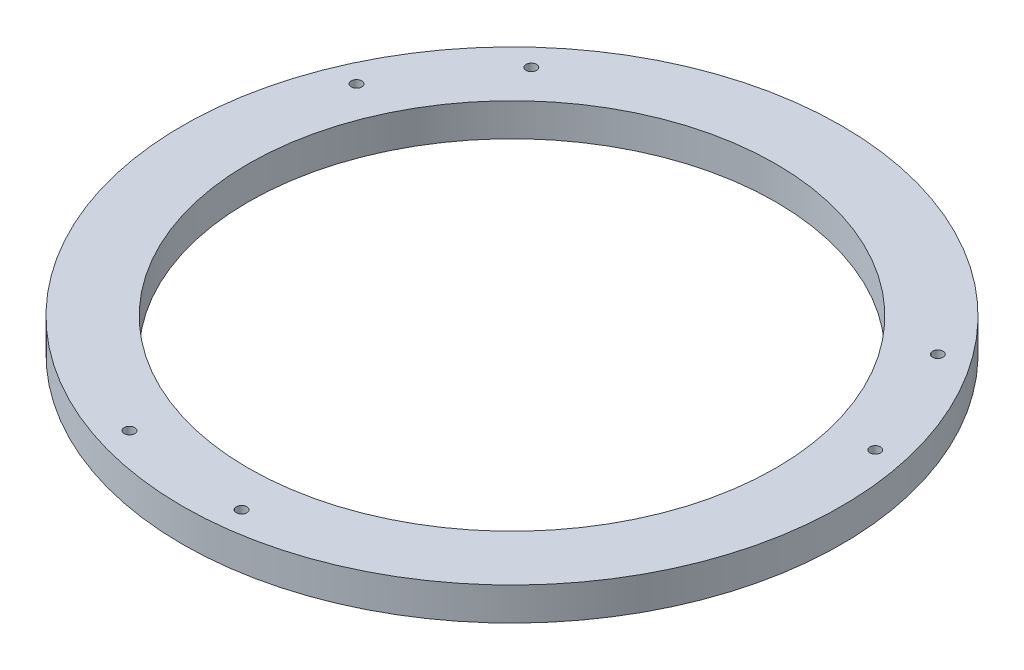
ISO-10303-21;
HEADER;
FILE_DESCRIPTION(('STEP AP214'),'2;1');
FILE_NAME('part.step','',(''),(''),'','','');
FILE_SCHEMA(('AUTOMOTIVE_DESIGN { 1 0 10303 214 1 1 1 1 }'));
ENDSEC;
DATA;
#1=APPLICATION_CONTEXT('core data for automotive mechanical design processes');
#2=APPLICATION_PROTOCOL_DEFINITION('international standard','automotive_design',2000,#1);
#3=PRODUCT_CONTEXT('',#1,'mechanical');
#4=PRODUCT('Part','Part','',(#3));
#5=PRODUCT_RELATED_PRODUCT_CATEGORY('part','',(#4));
#6=PRODUCT_DEFINITION_FORMATION('','',#4);
#7=PRODUCT_DEFINITION_CONTEXT('part definition',#1,'design');
#8=PRODUCT_DEFINITION('design','',#6,#7);
#9=PRODUCT_DEFINITION_SHAPE('','',#8);
#10=(LENGTH_UNIT() NAMED_UNIT(*) SI_UNIT(.MILLI.,.METRE.));
#11=(NAMED_UNIT(*) PLANE_ANGLE_UNIT() SI_UNIT($,.RADIAN.));
#12=(NAMED_UNIT(*) SI_UNIT($,.STERADIAN.) SOLID_ANGLE_UNIT());
#13=UNCERTAINTY_MEASURE_WITH_UNIT(LENGTH_MEASURE(1.E-05),#10,'distance_accuracy_value','');
#14=(GEOMETRIC_REPRESENTATION_CONTEXT(3) GLOBAL_UNCERTAINTY_ASSIGNED_CONTEXT((#13)) GLOBAL_UNIT_ASSIGNED_CONTEXT((#10,
#11,#12)) REPRESENTATION_CONTEXT('',''));
#15=CARTESIAN_POINT('',(0.,0.,0.));
#16=DIRECTION('',(0.,0.,1.));
#17=DIRECTION('',(1.,0.,0.));
#18=AXIS2_PLACEMENT_3D('',#15,#16,#17);
#19=CARTESIAN_POINT('',(0.,10.,0.));
#20=DIRECTION('',(0.,1.,0.));
#21=DIRECTION('',(0.,0.,1.));
#22=AXIS2_PLACEMENT_3D('',#19,#20,#21);
#23=PLANE('',#22);
#24=CARTESIAN_POINT('',(-27.9121513229262,10.,88.1598650664015));
#25=DIRECTION('',(0.,1.,0.));
#26=DIRECTION('',(0.866025403784436,0.,-0.500000000000004));
#27=AXIS2_PLACEMENT_3D('',#24,#25,#26);
#28=CIRCLE('',#27,1.60000000000001);
#29=CARTESIAN_POINT('',(-26.5265106768711,10.,87.3598650664015));
#30=VERTEX_POINT('',#29);
#31=EDGE_CURVE('E332',#30,#30,#28,.T.);
#32=ORIENTED_EDGE('',*,*,#31,.F.);
#33=EDGE_LOOP('',(#32));
#34=FACE_BOUND('',#33,.T.);
#35=CARTESIAN_POINT('',(9.89920365073338,10.,91.9415888870828));
#36=DIRECTION('',(0.,1.,0.));
#37=DIRECTION('',(0.866025403784436,0.,-0.500000000000004));
#38=AXIS2_PLACEMENT_3D('',#35,#36,#37);
#39=CIRCLE('',#38,1.59999999999999);
#40=CARTESIAN_POINT('',(11.2848442967885,10.,91.1415888870828));
#41=VERTEX_POINT('',#40);
#42=EDGE_CURVE('E336',#41,#41,#39,.T.);
#43=ORIENTED_EDGE('',*,*,#42,.F.);
#44=EDGE_LOOP('',(#43));
#45=FACE_BOUND('',#44,.T.);
#46=CARTESIAN_POINT('',(90.304758403175,10.,-19.9073004132716));
#47=DIRECTION('',(0.,1.,0.));
#48=DIRECTION('',(-0.866025403784443,0.,-0.499999999999992));
#49=AXIS2_PLACEMENT_3D('',#46,#47,#48);
#50=CIRCLE('',#49,1.60000000000001);
#51=CARTESIAN_POINT('',(88.9191177571199,10.,-20.7073004132716));
#52=VERTEX_POINT('',#51);
#53=EDGE_CURVE('E339',#52,#52,#50,.T.);
#54=ORIENTED_EDGE('',*,*,#53,.F.);
#55=EDGE_LOOP('',(#54));
#56=FACE_BOUND('',#55,.T.);
#57=CARTESIAN_POINT('',(74.6741498151518,10.,-54.5437562823125));
#58=DIRECTION('',(0.,1.,0.));
#59=DIRECTION('',(-0.866025403784443,0.,-0.499999999999992));
#60=AXIS2_PLACEMENT_3D('',#57,#58,#59);
#61=CIRCLE('',#60,1.59999999999999);
#62=CARTESIAN_POINT('',(73.2885091690967,10.,-55.3437562823125));
#63=VERTEX_POINT('',#62);
#64=EDGE_CURVE('E342',#63,#63,#61,.T.);
#65=ORIENTED_EDGE('',*,*,#64,.F.);
#66=EDGE_LOOP('',(#65));
#67=FACE_BOUND('',#66,.T.);
#68=CARTESIAN_POINT('',(-62.3926070802485,10.,-68.2525646531305));
#69=DIRECTION('',(0.,1.,0.));
#70=DIRECTION('',(0.,0.,1.));
#71=AXIS2_PLACEMENT_3D('',#68,#69,#70);
#72=CIRCLE('',#71,1.60000000000001);
#73=CARTESIAN_POINT('',(-62.3926070802485,10.,-66.6525646531306));
#74=VERTEX_POINT('',#73);
#75=EDGE_CURVE('E409',#74,#74,#72,.T.);
#76=ORIENTED_EDGE('',*,*,#75,.F.);
#77=EDGE_LOOP('',(#76));
#78=FACE_BOUND('',#77,.T.);
#79=CARTESIAN_POINT('',(-84.5733534658852,10.,-37.397832604771));
#80=DIRECTION('',(0.,1.,0.));
#81=DIRECTION('',(0.,0.,1.));
#82=AXIS2_PLACEMENT_3D('',#79,#80,#81);
#83=CIRCLE('',#82,1.59999999999999);
#84=CARTESIAN_POINT('',(-84.5733534658852,10.,-35.797832604771));
#85=VERTEX_POINT('',#84);
#86=EDGE_CURVE('E413',#85,#85,#83,.T.);
#87=ORIENTED_EDGE('',*,*,#86,.F.);
#88=EDGE_LOOP('',(#87));
#89=FACE_BOUND('',#88,.T.);
#90=CARTESIAN_POINT('',(0.,10.,0.));
#91=DIRECTION('',(0.,1.,0.));
#92=DIRECTION('',(0.,0.,1.));
#93=AXIS2_PLACEMENT_3D('',#90,#91,#92);
#94=CIRCLE('',#93,100.);
#95=CARTESIAN_POINT('',(0.,10.,100.));
#96=VERTEX_POINT('',#95);
#97=EDGE_CURVE('E11',#96,#96,#94,.T.);
#98=ORIENTED_EDGE('',*,*,#97,.T.);
#99=EDGE_LOOP('',(#98));
#100=FACE_BOUND('',#99,.T.);
#101=CARTESIAN_POINT('',(0.,10.,0.));
#102=DIRECTION('',(0.,1.,0.));
#103=DIRECTION('',(0.,0.,1.));
#104=AXIS2_PLACEMENT_3D('',#101,#102,#103);
#105=CIRCLE('',#104,80.);
#106=CARTESIAN_POINT('',(0.,10.,80.));
#107=VERTEX_POINT('',#106);
#108=EDGE_CURVE('E417',#107,#107,#105,.T.);
#109=ORIENTED_EDGE('',*,*,#108,.F.);
#110=EDGE_LOOP('',(#109));
#111=FACE_BOUND('',#110,.T.);
#112=ADVANCED_FACE('F33',(#34,#45,#56,#67,#78,#89,#100,#111),#23,.T.);
#113=CARTESIAN_POINT('',(0.,0.,0.));
#114=DIRECTION('',(0.,1.,0.));
#115=DIRECTION('',(0.,0.,1.));
#116=AXIS2_PLACEMENT_3D('',#113,#114,#115);
#117=PLANE('',#116);
#118=DIRECTION('',(-0.193244388605381,0.,-0.981150654218063));
#119=VECTOR('',#118,1.);
#120=CARTESIAN_POINT('',(87.0164522832693,0.,-22.1134379569871));
#121=LINE('',#120,#119);
#122=CARTESIAN_POINT('',(88.0986208594595,0.,-16.618994293366));
#123=VERTEX_POINT('',#122);
#124=CARTESIAN_POINT('',(87.0164522832693,0.,-22.1134379569871));
#125=VERTEX_POINT('',#124);
#126=EDGE_CURVE('E286',#123,#125,#121,.T.);
#127=ORIENTED_EDGE('',*,*,#126,.F.);
#128=DIRECTION('',(-0.981150654218062,0.,0.193244388605387));
#129=VECTOR('',#128,1.);
#130=CARTESIAN_POINT('',(88.0986208594595,0.,-16.618994293366));
#131=LINE('',#130,#129);
#132=CARTESIAN_POINT('',(93.5930645230806,0.,-17.7011628695561));
#133=VERTEX_POINT('',#132);
#134=EDGE_CURVE('E50',#133,#123,#131,.T.);
#135=ORIENTED_EDGE('',*,*,#134,.F.);
#136=DIRECTION('',(0.193244388605385,0.,0.981150654218062));
#137=VECTOR('',#136,1.);
#138=CARTESIAN_POINT('',(93.5930645230806,0.,-17.7011628695561));
#139=LINE('',#138,#137);
#140=CARTESIAN_POINT('',(92.5108959468905,0.,-23.1956065331773));
#141=VERTEX_POINT('',#140);
#142=EDGE_CURVE('E275',#141,#133,#139,.T.);
#143=ORIENTED_EDGE('',*,*,#142,.F.);
#144=DIRECTION('',(0.981150654218061,0.,-0.19324438860539));
#145=VECTOR('',#144,1.);
#146=CARTESIAN_POINT('',(92.5108959468905,0.,-23.1956065331773));
#147=LINE('',#146,#145);
#148=EDGE_CURVE('E289',#125,#141,#147,.T.);
#149=ORIENTED_EDGE('',*,*,#148,.F.);
#150=EDGE_LOOP('',(#127,#135,#143,#149));
#151=FACE_BOUND('',#150,.T.);
#152=DIRECTION('',(-0.588102543410552,0.,-0.8087863737935));
#153=VECTOR('',#152,1.);
#154=CARTESIAN_POINT('',(74.0562350900795,0.,-50.6324673141412));
#155=LINE('',#154,#153);
#156=CARTESIAN_POINT('',(74.0562350900795,0.,-50.6324673141412));
#157=VERTEX_POINT('',#156);
#158=CARTESIAN_POINT('',(70.7628608469804,0.,-55.1616710073848));
#159=VERTEX_POINT('',#158);
#160=EDGE_CURVE('E256',#157,#159,#155,.T.);
#161=ORIENTED_EDGE('',*,*,#160,.F.);
#162=DIRECTION('',(-0.808786373793503,0.,0.588102543410548));
#163=VECTOR('',#162,1.);
#164=CARTESIAN_POINT('',(74.0562350900795,0.,-50.6324673141412));
#165=LINE('',#164,#163);
#166=CARTESIAN_POINT('',(78.5854387833231,0.,-53.9258415572402));
#167=VERTEX_POINT('',#166);
#168=EDGE_CURVE('E58',#167,#157,#165,.T.);
#169=ORIENTED_EDGE('',*,*,#168,.F.);
#170=DIRECTION('',(0.588102543410553,0.,0.8087863737935));
#171=VECTOR('',#170,1.);
#172=CARTESIAN_POINT('',(78.5854387833231,0.,-53.9258415572402));
#173=LINE('',#172,#171);
#174=CARTESIAN_POINT('',(75.292064540224,0.,-58.4550452504838));
#175=VERTEX_POINT('',#174);
#176=EDGE_CURVE('E245',#175,#167,#173,.T.);
#177=ORIENTED_EDGE('',*,*,#176,.F.);
#178=DIRECTION('',(0.808786373793502,0.,-0.58810254341055));
#179=VECTOR('',#178,1.);
#180=CARTESIAN_POINT('',(70.7628608469804,0.,-55.1616710073848));
#181=LINE('',#180,#179);
#182=EDGE_CURVE('E260',#159,#175,#181,.T.);
#183=ORIENTED_EDGE('',*,*,#182,.F.);
#184=EDGE_LOOP('',(#161,#169,#177,#183));
#185=FACE_BOUND('',#184,.T.);
#186=DIRECTION('',(0.946323585795253,0.,0.323220777437983));
#187=VECTOR('',#186,1.);
#188=CARTESIAN_POINT('',(-24.3574271058732,0.,86.4151772030011));
#189=LINE('',#188,#187);
#190=CARTESIAN_POINT('',(-29.6568391863266,0.,84.6051408493484));
#191=VERTEX_POINT('',#190);
#192=CARTESIAN_POINT('',(-24.3574271058732,0.,86.4151772030011));
#193=VERTEX_POINT('',#192);
#194=EDGE_CURVE('E230',#191,#193,#189,.T.);
#195=ORIENTED_EDGE('',*,*,#194,.F.);
#196=DIRECTION('',(0.323220777437978,0.,-0.946323585795255));
#197=VECTOR('',#196,1.);
#198=CARTESIAN_POINT('',(-29.6568391863266,0.,84.6051408493484));
#199=LINE('',#198,#197);
#200=CARTESIAN_POINT('',(-31.4668755399793,0.,89.9045529298019));
#201=VERTEX_POINT('',#200);
#202=EDGE_CURVE('E203',#201,#191,#199,.T.);
#203=ORIENTED_EDGE('',*,*,#202,.F.);
#204=DIRECTION('',(-0.946323585795254,0.,-0.32322077743798));
#205=VECTOR('',#204,1.);
#206=CARTESIAN_POINT('',(-31.4668755399793,0.,89.9045529298019));
#207=LINE('',#206,#205);
#208=CARTESIAN_POINT('',(-26.1674634595258,0.,91.7145892834546));
#209=VERTEX_POINT('',#208);
#210=EDGE_CURVE('E221',#209,#201,#207,.T.);
#211=ORIENTED_EDGE('',*,*,#210,.F.);
#212=DIRECTION('',(-0.323220777437975,0.,0.946323585795256));
#213=VECTOR('',#212,1.);
#214=CARTESIAN_POINT('',(-26.1674634595258,0.,91.7145892834546));
#215=LINE('',#214,#213);
#216=EDGE_CURVE('E224',#193,#209,#215,.T.);
#217=ORIENTED_EDGE('',*,*,#216,.F.);
#218=EDGE_LOOP('',(#195,#203,#211,#217));
#219=FACE_BOUND('',#218,.T.);
#220=DIRECTION('',(0.994480817645145,0.,-0.104918555727024));
#221=VECTOR('',#220,1.);
#222=CARTESIAN_POINT('',(6.82088540529133,0.,89.4508145537121));
#223=LINE('',#222,#221);
#224=CARTESIAN_POINT('',(6.82088540529133,0.,89.4508145537121));
#225=VERTEX_POINT('',#224);
#226=CARTESIAN_POINT('',(12.3899779841041,0.,88.8632706416407));
#227=VERTEX_POINT('',#226);
#228=EDGE_CURVE('E315',#225,#227,#223,.T.);
#229=ORIENTED_EDGE('',*,*,#228,.F.);
#230=DIRECTION('',(-0.104918555727019,0.,-0.994480817645146));
#231=VECTOR('',#230,1.);
#232=CARTESIAN_POINT('',(6.82088540529133,0.,89.4508145537121));
#233=LINE('',#232,#231);
#234=CARTESIAN_POINT('',(7.40842931736263,0.,95.0199071325249));
#235=VERTEX_POINT('',#234);
#236=EDGE_CURVE('E237',#235,#225,#233,.T.);
#237=ORIENTED_EDGE('',*,*,#236,.F.);
#238=DIRECTION('',(-0.994480817645145,0.,0.104918555727025));
#239=VECTOR('',#238,1.);
#240=CARTESIAN_POINT('',(7.40842931736263,0.,95.0199071325249));
#241=LINE('',#240,#239);
#242=CARTESIAN_POINT('',(12.9775218961754,0.,94.4323632204535));
#243=VERTEX_POINT('',#242);
#244=EDGE_CURVE('E304',#243,#235,#241,.T.);
#245=ORIENTED_EDGE('',*,*,#244,.F.);
#246=DIRECTION('',(0.104918555727022,0.,0.994480817645145));
#247=VECTOR('',#246,1.);
#248=CARTESIAN_POINT('',(12.3899779841041,0.,88.8632706416407));
#249=LINE('',#248,#247);
#250=EDGE_CURVE('E318',#227,#243,#249,.T.);
#251=ORIENTED_EDGE('',*,*,#250,.F.);
#252=EDGE_LOOP('',(#229,#237,#245,#251));
#253=FACE_BOUND('',#252,.T.);
#254=DIRECTION('',(-0.4063782742346,0.,0.913704929520525));
#255=VECTOR('',#254,1.);
#256=CARTESIAN_POINT('',(-80.8771204953709,0.,-38.8183472395716));
#257=LINE('',#256,#255);
#258=CARTESIAN_POINT('',(-80.8771204953709,0.,-38.8183472395716));
#259=VERTEX_POINT('',#258);
#260=CARTESIAN_POINT('',(-83.1528388310847,0.,-33.7015996342567));
#261=VERTEX_POINT('',#260);
#262=EDGE_CURVE('E361',#259,#261,#257,.T.);
#263=ORIENTED_EDGE('',*,*,#262,.F.);
#264=DIRECTION('',(0.913704929520523,0.,0.406378274234605));
#265=VECTOR('',#264,1.);
#266=CARTESIAN_POINT('',(-80.8771204953709,0.,-38.8183472395716));
#267=LINE('',#266,#265);
#268=CARTESIAN_POINT('',(-85.9938681006858,0.,-41.0940655752854));
#269=VERTEX_POINT('',#268);
#270=EDGE_CURVE('E359',#269,#259,#267,.T.);
#271=ORIENTED_EDGE('',*,*,#270,.F.);
#272=DIRECTION('',(0.406378274234599,0.,-0.913704929520526));
#273=VECTOR('',#272,1.);
#274=CARTESIAN_POINT('',(-85.9938681006858,0.,-41.0940655752854));
#275=LINE('',#274,#273);
#276=CARTESIAN_POINT('',(-88.2695864363996,0.,-35.9773179699704));
#277=VERTEX_POINT('',#276);
#278=EDGE_CURVE('E349',#277,#269,#275,.T.);
#279=ORIENTED_EDGE('',*,*,#278,.F.);
#280=DIRECTION('',(-0.913704929520524,0.,-0.406378274234603));
#281=VECTOR('',#280,1.);
#282=CARTESIAN_POINT('',(-83.1528388310847,0.,-33.7015996342567));
#283=LINE('',#282,#281);
#284=EDGE_CURVE('E365',#261,#277,#283,.T.);
#285=ORIENTED_EDGE('',*,*,#284,.F.);
#286=EDGE_LOOP('',(#263,#271,#279,#285));
#287=FACE_BOUND('',#286,.T.);
#288=DIRECTION('',(-0.753079197189879,0.,0.657929876780077));
#289=VECTOR('',#288,1.);
#290=CARTESIAN_POINT('',(-62.659025177396,0.,-64.3017392460147));
#291=LINE('',#290,#289);
#292=CARTESIAN_POINT('',(-58.4417816731327,0.,-67.9861465559831));
#293=VERTEX_POINT('',#292);
#294=CARTESIAN_POINT('',(-62.659025177396,0.,-64.3017392460147));
#295=VERTEX_POINT('',#294);
#296=EDGE_CURVE('E394',#293,#295,#291,.T.);
#297=ORIENTED_EDGE('',*,*,#296,.F.);
#298=DIRECTION('',(0.657929876780081,0.,0.753079197189876));
#299=VECTOR('',#298,1.);
#300=CARTESIAN_POINT('',(-58.4417816731327,0.,-67.9861465559831));
#301=LINE('',#300,#299);
#302=CARTESIAN_POINT('',(-62.1261889831011,0.,-72.2033900602464));
#303=VERTEX_POINT('',#302);
#304=EDGE_CURVE('E335',#303,#293,#301,.T.);
#305=ORIENTED_EDGE('',*,*,#304,.F.);
#306=DIRECTION('',(0.753079197189877,0.,-0.657929876780079));
#307=VECTOR('',#306,1.);
#308=CARTESIAN_POINT('',(-62.1261889831011,0.,-72.2033900602464));
#309=LINE('',#308,#307);
#310=CARTESIAN_POINT('',(-66.3434324873644,0.,-68.518982750278));
#311=VERTEX_POINT('',#310);
#312=EDGE_CURVE('E383',#311,#303,#309,.T.);
#313=ORIENTED_EDGE('',*,*,#312,.F.);
#314=DIRECTION('',(-0.657929876780083,0.,-0.753079197189874));
#315=VECTOR('',#314,1.);
#316=CARTESIAN_POINT('',(-66.3434324873644,0.,-68.518982750278));
#317=LINE('',#316,#315);
#318=EDGE_CURVE('E397',#295,#311,#317,.T.);
#319=ORIENTED_EDGE('',*,*,#318,.F.);
#320=EDGE_LOOP('',(#297,#305,#313,#319));
#321=FACE_BOUND('',#320,.T.);
#322=CARTESIAN_POINT('',(0.,0.,0.));
#323=DIRECTION('',(0.,1.,0.));
#324=DIRECTION('',(0.,0.,1.));
#325=AXIS2_PLACEMENT_3D('',#322,#323,#324);
#326=CIRCLE('',#325,100.);
#327=CARTESIAN_POINT('',(0.,0.,100.));
#328=VERTEX_POINT('',#327);
#329=EDGE_CURVE('E42',#328,#328,#326,.T.);
#330=ORIENTED_EDGE('',*,*,#329,.F.);
#331=EDGE_LOOP('',(#330));
#332=FACE_BOUND('',#331,.T.);
#333=CARTESIAN_POINT('',(0.,0.,0.));
#334=DIRECTION('',(0.,1.,0.));
#335=DIRECTION('',(0.,0.,1.));
#336=AXIS2_PLACEMENT_3D('',#333,#334,#335);
#337=CIRCLE('',#336,80.);
#338=CARTESIAN_POINT('',(0.,0.,80.));
#339=VERTEX_POINT('',#338);
#340=EDGE_CURVE('E412',#339,#339,#337,.T.);
#341=ORIENTED_EDGE('',*,*,#340,.T.);
#342=EDGE_LOOP('',(#341));
#343=FACE_BOUND('',#342,.T.);
#344=ADVANCED_FACE('F460',(#151,#185,#219,#253,#287,#321,#332,#343),#117,.F.);
#345=CARTESIAN_POINT('',(0.,10.,0.));
#346=DIRECTION('',(0.,-1.,0.));
#347=DIRECTION('',(0.,0.,-1.));
#348=AXIS2_PLACEMENT_3D('',#345,#346,#347);
#349=CYLINDRICAL_SURFACE('',#348,100.);
#350=ORIENTED_EDGE('',*,*,#97,.F.);
#351=EDGE_LOOP('',(#350));
#352=FACE_BOUND('',#351,.T.);
#353=ORIENTED_EDGE('',*,*,#329,.T.);
#354=EDGE_LOOP('',(#353));
#355=FACE_BOUND('',#354,.T.);
#356=ADVANCED_FACE('F35',(#352,#355),#349,.T.);
#357=CARTESIAN_POINT('',(0.,10.,0.));
#358=DIRECTION('',(0.,-1.,0.));
#359=DIRECTION('',(0.,0.,-1.));
#360=AXIS2_PLACEMENT_3D('',#357,#358,#359);
#361=CYLINDRICAL_SURFACE('',#360,80.);
#362=ORIENTED_EDGE('',*,*,#108,.T.);
#363=EDGE_LOOP('',(#362));
#364=FACE_BOUND('',#363,.T.);
#365=ORIENTED_EDGE('',*,*,#340,.F.);
#366=EDGE_LOOP('',(#365));
#367=FACE_BOUND('',#366,.T.);
#368=ADVANCED_FACE('F470',(#364,#367),#361,.F.);
#369=CARTESIAN_POINT('',(-84.5733534658852,0.,-37.397832604771));
#370=DIRECTION('',(0.,1.,0.));
#371=DIRECTION('',(0.,0.,1.));
#372=AXIS2_PLACEMENT_3D('',#369,#370,#371);
#373=CYLINDRICAL_SURFACE('',#372,1.59999999999999);
#374=CARTESIAN_POINT('',(-84.5733534658852,3.,-37.397832604771));
#375=DIRECTION('',(0.,1.,0.));
#376=DIRECTION('',(0.,0.,1.));
#377=AXIS2_PLACEMENT_3D('',#374,#375,#376);
#378=CIRCLE('',#377,1.59999999999999);
#379=CARTESIAN_POINT('',(-84.5733534658852,3.,-35.797832604771));
#380=VERTEX_POINT('',#379);
#381=EDGE_CURVE('E416',#380,#380,#378,.F.);
#382=ORIENTED_EDGE('',*,*,#381,.T.);
#383=EDGE_LOOP('',(#382));
#384=FACE_BOUND('',#383,.T.);
#385=ORIENTED_EDGE('',*,*,#86,.T.);
#386=EDGE_LOOP('',(#385));
#387=FACE_BOUND('',#386,.T.);
#388=ADVANCED_FACE('F473',(#384,#387),#373,.F.);
#389=CARTESIAN_POINT('',(-62.3926070802485,0.,-68.2525646531305));
#390=DIRECTION('',(0.,1.,0.));
#391=DIRECTION('',(0.,0.,1.));
#392=AXIS2_PLACEMENT_3D('',#389,#390,#391);
#393=CYLINDRICAL_SURFACE('',#392,1.60000000000001);
#394=CARTESIAN_POINT('',(-62.3926070802485,3.,-68.2525646531305));
#395=DIRECTION('',(0.,1.,0.));
#396=DIRECTION('',(0.,0.,1.));
#397=AXIS2_PLACEMENT_3D('',#394,#395,#396);
#398=CIRCLE('',#397,1.60000000000001);
#399=CARTESIAN_POINT('',(-62.3926070802485,3.,-66.6525646531306));
#400=VERTEX_POINT('',#399);
#401=EDGE_CURVE('E372',#400,#400,#398,.F.);
#402=ORIENTED_EDGE('',*,*,#401,.T.);
#403=EDGE_LOOP('',(#402));
#404=FACE_BOUND('',#403,.T.);
#405=ORIENTED_EDGE('',*,*,#75,.T.);
#406=EDGE_LOOP('',(#405));
#407=FACE_BOUND('',#406,.T.);
#408=ADVANCED_FACE('F477',(#404,#407),#393,.F.);
#409=CARTESIAN_POINT('',(0.,3.,0.));
#410=DIRECTION('',(0.,1.,0.));
#411=DIRECTION('',(0.,0.,1.));
#412=AXIS2_PLACEMENT_3D('',#409,#410,#411);
#413=PLANE('',#412);
#414=DIRECTION('',(0.657929876780081,0.,0.753079197189876));
#415=VECTOR('',#414,1.);
#416=CARTESIAN_POINT('',(-58.4417816731327,3.,-67.9861465559831));
#417=LINE('',#416,#415);
#418=CARTESIAN_POINT('',(-62.1261889831011,3.,-72.2033900602464));
#419=VERTEX_POINT('',#418);
#420=CARTESIAN_POINT('',(-58.4417816731327,3.,-67.9861465559831));
#421=VERTEX_POINT('',#420);
#422=EDGE_CURVE('E379',#419,#421,#417,.T.);
#423=ORIENTED_EDGE('',*,*,#422,.T.);
#424=DIRECTION('',(-0.753079197189879,0.,0.657929876780077));
#425=VECTOR('',#424,1.);
#426=CARTESIAN_POINT('',(-62.659025177396,3.,-64.3017392460147));
#427=LINE('',#426,#425);
#428=CARTESIAN_POINT('',(-62.659025177396,3.,-64.3017392460147));
#429=VERTEX_POINT('',#428);
#430=EDGE_CURVE('E382',#421,#429,#427,.T.);
#431=ORIENTED_EDGE('',*,*,#430,.T.);
#432=DIRECTION('',(-0.657929876780083,0.,-0.753079197189874));
#433=VECTOR('',#432,1.);
#434=CARTESIAN_POINT('',(-66.3434324873644,3.,-68.518982750278));
#435=LINE('',#434,#433);
#436=CARTESIAN_POINT('',(-66.3434324873644,3.,-68.518982750278));
#437=VERTEX_POINT('',#436);
#438=EDGE_CURVE('E386',#429,#437,#435,.T.);
#439=ORIENTED_EDGE('',*,*,#438,.T.);
#440=DIRECTION('',(0.753079197189877,0.,-0.657929876780079));
#441=VECTOR('',#440,1.);
#442=CARTESIAN_POINT('',(-62.1261889831011,3.,-72.2033900602464));
#443=LINE('',#442,#441);
#444=EDGE_CURVE('E389',#437,#419,#443,.T.);
#445=ORIENTED_EDGE('',*,*,#444,.T.);
#446=EDGE_LOOP('',(#423,#431,#439,#445));
#447=FACE_BOUND('',#446,.T.);
#448=ORIENTED_EDGE('',*,*,#401,.F.);
#449=EDGE_LOOP('',(#448));
#450=FACE_BOUND('',#449,.T.);
#451=ADVANCED_FACE('F481',(#447,#450),#413,.F.);
#452=CARTESIAN_POINT('',(-58.4417816731327,3.,-67.9861465559831));
#453=DIRECTION('',(0.753079197189876,0.,-0.657929876780081));
#454=DIRECTION('',(-0.657929876780081,0.,-0.753079197189876));
#455=AXIS2_PLACEMENT_3D('',#452,#453,#454);
#456=PLANE('',#455);
#457=ORIENTED_EDGE('',*,*,#304,.T.);
#458=DIRECTION('',(0.,-1.,0.));
#459=VECTOR('',#458,1.);
#460=CARTESIAN_POINT('',(-58.4417816731327,3.,-67.9861465559831));
#461=LINE('',#460,#459);
#462=EDGE_CURVE('E392',#421,#293,#461,.T.);
#463=ORIENTED_EDGE('',*,*,#462,.F.);
#464=ORIENTED_EDGE('',*,*,#422,.F.);
#465=DIRECTION('',(0.,-1.,0.));
#466=VECTOR('',#465,1.);
#467=CARTESIAN_POINT('',(-62.1261889831011,3.,-72.2033900602464));
#468=LINE('',#467,#466);
#469=EDGE_CURVE('E362',#419,#303,#468,.T.);
#470=ORIENTED_EDGE('',*,*,#469,.T.);
#471=EDGE_LOOP('',(#457,#463,#464,#470));
#472=FACE_BOUND('',#471,.T.);
#473=ADVANCED_FACE('F483',(#472),#456,.F.);
#474=CARTESIAN_POINT('',(-62.1261889831011,3.,-72.2033900602464));
#475=DIRECTION('',(-0.65792987678008,0.,-0.753079197189877));
#476=DIRECTION('',(-0.753079197189877,0.,0.65792987678008));
#477=AXIS2_PLACEMENT_3D('',#474,#475,#476);
#478=PLANE('',#477);
#479=ORIENTED_EDGE('',*,*,#312,.T.);
#480=ORIENTED_EDGE('',*,*,#469,.F.);
#481=ORIENTED_EDGE('',*,*,#444,.F.);
#482=DIRECTION('',(0.,-1.,0.));
#483=VECTOR('',#482,1.);
#484=CARTESIAN_POINT('',(-66.3434324873644,3.,-68.518982750278));
#485=LINE('',#484,#483);
#486=EDGE_CURVE('E403',#437,#311,#485,.T.);
#487=ORIENTED_EDGE('',*,*,#486,.T.);
#488=EDGE_LOOP('',(#479,#480,#481,#487));
#489=FACE_BOUND('',#488,.T.);
#490=ADVANCED_FACE('F486',(#489),#478,.F.);
#491=CARTESIAN_POINT('',(-66.3434324873644,3.,-68.518982750278));
#492=DIRECTION('',(-0.753079197189874,0.,0.657929876780083));
#493=DIRECTION('',(0.657929876780083,0.,0.753079197189874));
#494=AXIS2_PLACEMENT_3D('',#491,#492,#493);
#495=PLANE('',#494);
#496=ORIENTED_EDGE('',*,*,#318,.T.);
#497=ORIENTED_EDGE('',*,*,#486,.F.);
#498=ORIENTED_EDGE('',*,*,#438,.F.);
#499=DIRECTION('',(0.,-1.,0.));
#500=VECTOR('',#499,1.);
#501=CARTESIAN_POINT('',(-62.659025177396,3.,-64.3017392460147));
#502=LINE('',#501,#500);
#503=EDGE_CURVE('E405',#429,#295,#502,.T.);
#504=ORIENTED_EDGE('',*,*,#503,.T.);
#505=EDGE_LOOP('',(#496,#497,#498,#504));
#506=FACE_BOUND('',#505,.T.);
#507=ADVANCED_FACE('F492',(#506),#495,.F.);
#508=CARTESIAN_POINT('',(-62.659025177396,3.,-64.3017392460147));
#509=DIRECTION('',(0.657929876780077,0.,0.753079197189879));
#510=DIRECTION('',(0.753079197189879,0.,-0.657929876780077));
#511=AXIS2_PLACEMENT_3D('',#508,#509,#510);
#512=PLANE('',#511);
#513=ORIENTED_EDGE('',*,*,#296,.T.);
#514=ORIENTED_EDGE('',*,*,#503,.F.);
#515=ORIENTED_EDGE('',*,*,#430,.F.);
#516=ORIENTED_EDGE('',*,*,#462,.T.);
#517=EDGE_LOOP('',(#513,#514,#515,#516));
#518=FACE_BOUND('',#517,.T.);
#519=ADVANCED_FACE('F488',(#518),#512,.F.);
#520=CARTESIAN_POINT('',(0.,3.,0.));
#521=DIRECTION('',(0.,1.,0.));
#522=DIRECTION('',(0.,0.,1.));
#523=AXIS2_PLACEMENT_3D('',#520,#521,#522);
#524=PLANE('',#523);
#525=DIRECTION('',(0.913704929520523,0.,0.406378274234605));
#526=VECTOR('',#525,1.);
#527=CARTESIAN_POINT('',(-80.8771204953709,3.,-38.8183472395716));
#528=LINE('',#527,#526);
#529=CARTESIAN_POINT('',(-85.9938681006858,3.,-41.0940655752854));
#530=VERTEX_POINT('',#529);
#531=CARTESIAN_POINT('',(-80.8771204953709,3.,-38.8183472395716));
#532=VERTEX_POINT('',#531);
#533=EDGE_CURVE('E345',#530,#532,#528,.T.);
#534=ORIENTED_EDGE('',*,*,#533,.T.);
#535=DIRECTION('',(-0.4063782742346,0.,0.913704929520525));
#536=VECTOR('',#535,1.);
#537=CARTESIAN_POINT('',(-80.8771204953709,3.,-38.8183472395716));
#538=LINE('',#537,#536);
#539=CARTESIAN_POINT('',(-83.1528388310847,3.,-33.7015996342567));
#540=VERTEX_POINT('',#539);
#541=EDGE_CURVE('E348',#532,#540,#538,.T.);
#542=ORIENTED_EDGE('',*,*,#541,.T.);
#543=DIRECTION('',(-0.913704929520524,0.,-0.406378274234603));
#544=VECTOR('',#543,1.);
#545=CARTESIAN_POINT('',(-83.1528388310847,3.,-33.7015996342567));
#546=LINE('',#545,#544);
#547=CARTESIAN_POINT('',(-88.2695864363996,3.,-35.9773179699704));
#548=VERTEX_POINT('',#547);
#549=EDGE_CURVE('E352',#540,#548,#546,.T.);
#550=ORIENTED_EDGE('',*,*,#549,.T.);
#551=DIRECTION('',(0.406378274234599,0.,-0.913704929520526));
#552=VECTOR('',#551,1.);
#553=CARTESIAN_POINT('',(-85.9938681006858,3.,-41.0940655752854));
#554=LINE('',#553,#552);
#555=EDGE_CURVE('E355',#548,#530,#554,.T.);
#556=ORIENTED_EDGE('',*,*,#555,.T.);
#557=EDGE_LOOP('',(#534,#542,#550,#556));
#558=FACE_BOUND('',#557,.T.);
#559=ORIENTED_EDGE('',*,*,#381,.F.);
#560=EDGE_LOOP('',(#559));
#561=FACE_BOUND('',#560,.T.);
#562=ADVANCED_FACE('F491',(#558,#561),#524,.F.);
#563=CARTESIAN_POINT('',(-80.8771204953709,3.,-38.8183472395716));
#564=DIRECTION('',(0.406378274234605,0.,-0.913704929520523));
#565=DIRECTION('',(-0.913704929520523,0.,-0.406378274234605));
#566=AXIS2_PLACEMENT_3D('',#563,#564,#565);
#567=PLANE('',#566);
#568=ORIENTED_EDGE('',*,*,#270,.T.);
#569=DIRECTION('',(0.,-1.,0.));
#570=VECTOR('',#569,1.);
#571=CARTESIAN_POINT('',(-80.8771204953709,3.,-38.8183472395716));
#572=LINE('',#571,#570);
#573=EDGE_CURVE('E358',#532,#259,#572,.T.);
#574=ORIENTED_EDGE('',*,*,#573,.F.);
#575=ORIENTED_EDGE('',*,*,#533,.F.);
#576=DIRECTION('',(0.,-1.,0.));
#577=VECTOR('',#576,1.);
#578=CARTESIAN_POINT('',(-85.9938681006858,3.,-41.0940655752854));
#579=LINE('',#578,#577);
#580=EDGE_CURVE('E370',#530,#269,#579,.T.);
#581=ORIENTED_EDGE('',*,*,#580,.T.);
#582=EDGE_LOOP('',(#568,#574,#575,#581));
#583=FACE_BOUND('',#582,.T.);
#584=ADVANCED_FACE('F503',(#583),#567,.F.);
#585=CARTESIAN_POINT('',(-85.9938681006858,3.,-41.0940655752854));
#586=DIRECTION('',(-0.913704929520526,0.,-0.406378274234599));
#587=DIRECTION('',(-0.406378274234599,0.,0.913704929520526));
#588=AXIS2_PLACEMENT_3D('',#585,#586,#587);
#589=PLANE('',#588);
#590=ORIENTED_EDGE('',*,*,#278,.T.);
#591=ORIENTED_EDGE('',*,*,#580,.F.);
#592=ORIENTED_EDGE('',*,*,#555,.F.);
#593=DIRECTION('',(0.,-1.,0.));
#594=VECTOR('',#593,1.);
#595=CARTESIAN_POINT('',(-88.2695864363996,3.,-35.9773179699704));
#596=LINE('',#595,#594);
#597=EDGE_CURVE('E373',#548,#277,#596,.T.);
#598=ORIENTED_EDGE('',*,*,#597,.T.);
#599=EDGE_LOOP('',(#590,#591,#592,#598));
#600=FACE_BOUND('',#599,.T.);
#601=ADVANCED_FACE('F506',(#600),#589,.F.);
#602=CARTESIAN_POINT('',(-83.1528388310847,3.,-33.7015996342567));
#603=DIRECTION('',(-0.406378274234603,0.,0.913704929520524));
#604=DIRECTION('',(0.913704929520524,0.,0.406378274234603));
#605=AXIS2_PLACEMENT_3D('',#602,#603,#604);
#606=PLANE('',#605);
#607=ORIENTED_EDGE('',*,*,#284,.T.);
#608=ORIENTED_EDGE('',*,*,#597,.F.);
#609=ORIENTED_EDGE('',*,*,#549,.F.);
#610=DIRECTION('',(0.,-1.,0.));
#611=VECTOR('',#610,1.);
#612=CARTESIAN_POINT('',(-83.1528388310847,3.,-33.7015996342567));
#613=LINE('',#612,#611);
#614=EDGE_CURVE('E375',#540,#261,#613,.T.);
#615=ORIENTED_EDGE('',*,*,#614,.T.);
#616=EDGE_LOOP('',(#607,#608,#609,#615));
#617=FACE_BOUND('',#616,.T.);
#618=ADVANCED_FACE('F511',(#617),#606,.F.);
#619=CARTESIAN_POINT('',(-80.8771204953709,3.,-38.8183472395716));
#620=DIRECTION('',(0.913704929520525,0.,0.4063782742346));
#621=DIRECTION('',(0.4063782742346,0.,-0.913704929520525));
#622=AXIS2_PLACEMENT_3D('',#619,#620,#621);
#623=PLANE('',#622);
#624=ORIENTED_EDGE('',*,*,#262,.T.);
#625=ORIENTED_EDGE('',*,*,#614,.F.);
#626=ORIENTED_EDGE('',*,*,#541,.F.);
#627=ORIENTED_EDGE('',*,*,#573,.T.);
#628=EDGE_LOOP('',(#624,#625,#626,#627));
#629=FACE_BOUND('',#628,.T.);
#630=ADVANCED_FACE('F508',(#629),#623,.F.);
#631=CARTESIAN_POINT('',(74.6741498151518,0.,-54.5437562823125));
#632=DIRECTION('',(0.,1.,0.));
#633=DIRECTION('',(0.,0.,1.));
#634=AXIS2_PLACEMENT_3D('',#631,#632,#633);
#635=CYLINDRICAL_SURFACE('',#634,1.59999999999999);
#636=CARTESIAN_POINT('',(74.6741498151518,3.,-54.5437562823125));
#637=DIRECTION('',(0.,1.,0.));
#638=DIRECTION('',(0.,0.,1.));
#639=AXIS2_PLACEMENT_3D('',#636,#637,#638);
#640=CIRCLE('',#639,1.59999999999999);
#641=CARTESIAN_POINT('',(74.6741498151518,3.,-52.9437562823125));
#642=VERTEX_POINT('',#641);
#643=EDGE_CURVE('E37',#642,#642,#640,.F.);
#644=ORIENTED_EDGE('',*,*,#643,.T.);
#645=EDGE_LOOP('',(#644));
#646=FACE_BOUND('',#645,.T.);
#647=ORIENTED_EDGE('',*,*,#64,.T.);
#648=EDGE_LOOP('',(#647));
#649=FACE_BOUND('',#648,.T.);
#650=ADVANCED_FACE('F439',(#646,#649),#635,.F.);
#651=CARTESIAN_POINT('',(90.304758403175,0.,-19.9073004132716));
#652=DIRECTION('',(0.,1.,0.));
#653=DIRECTION('',(0.,0.,1.));
#654=AXIS2_PLACEMENT_3D('',#651,#652,#653);
#655=CYLINDRICAL_SURFACE('',#654,1.60000000000001);
#656=CARTESIAN_POINT('',(90.304758403175,3.,-19.9073004132716));
#657=DIRECTION('',(0.,1.,0.));
#658=DIRECTION('',(0.,0.,1.));
#659=AXIS2_PLACEMENT_3D('',#656,#657,#658);
#660=CIRCLE('',#659,1.60000000000001);
#661=CARTESIAN_POINT('',(90.304758403175,3.,-18.3073004132716));
#662=VERTEX_POINT('',#661);
#663=EDGE_CURVE('E432',#662,#662,#660,.F.);
#664=ORIENTED_EDGE('',*,*,#663,.T.);
#665=EDGE_LOOP('',(#664));
#666=FACE_BOUND('',#665,.T.);
#667=ORIENTED_EDGE('',*,*,#53,.T.);
#668=EDGE_LOOP('',(#667));
#669=FACE_BOUND('',#668,.T.);
#670=ADVANCED_FACE('F524',(#666,#669),#655,.F.);
#671=CARTESIAN_POINT('',(9.89920365073338,0.,91.9415888870828));
#672=DIRECTION('',(0.,1.,0.));
#673=DIRECTION('',(0.,0.,1.));
#674=AXIS2_PLACEMENT_3D('',#671,#672,#673);
#675=CYLINDRICAL_SURFACE('',#674,1.59999999999999);
#676=CARTESIAN_POINT('',(9.89920365073338,3.,91.9415888870828));
#677=DIRECTION('',(0.,1.,0.));
#678=DIRECTION('',(0.,0.,1.));
#679=AXIS2_PLACEMENT_3D('',#676,#677,#678);
#680=CIRCLE('',#679,1.59999999999999);
#681=CARTESIAN_POINT('',(9.89920365073338,3.,93.5415888870828));
#682=VERTEX_POINT('',#681);
#683=EDGE_CURVE('E430',#682,#682,#680,.F.);
#684=ORIENTED_EDGE('',*,*,#683,.T.);
#685=EDGE_LOOP('',(#684));
#686=FACE_BOUND('',#685,.T.);
#687=ORIENTED_EDGE('',*,*,#42,.T.);
#688=EDGE_LOOP('',(#687));
#689=FACE_BOUND('',#688,.T.);
#690=ADVANCED_FACE('F527',(#686,#689),#675,.F.);
#691=CARTESIAN_POINT('',(-27.9121513229262,0.,88.1598650664015));
#692=DIRECTION('',(0.,1.,0.));
#693=DIRECTION('',(0.,0.,1.));
#694=AXIS2_PLACEMENT_3D('',#691,#692,#693);
#695=CYLINDRICAL_SURFACE('',#694,1.60000000000001);
#696=CARTESIAN_POINT('',(-27.9121513229262,3.,88.1598650664015));
#697=DIRECTION('',(0.,1.,0.));
#698=DIRECTION('',(0.,0.,1.));
#699=AXIS2_PLACEMENT_3D('',#696,#697,#698);
#700=CIRCLE('',#699,1.60000000000001);
#701=CARTESIAN_POINT('',(-27.9121513229262,3.,89.7598650664015));
#702=VERTEX_POINT('',#701);
#703=EDGE_CURVE('E325',#702,#702,#700,.F.);
#704=ORIENTED_EDGE('',*,*,#703,.T.);
#705=EDGE_LOOP('',(#704));
#706=FACE_BOUND('',#705,.T.);
#707=ORIENTED_EDGE('',*,*,#31,.T.);
#708=EDGE_LOOP('',(#707));
#709=FACE_BOUND('',#708,.T.);
#710=ADVANCED_FACE('F530',(#706,#709),#695,.F.);
#711=CARTESIAN_POINT('',(0.,3.,0.));
#712=DIRECTION('',(0.,1.,0.));
#713=DIRECTION('',(0.866025403784436,0.,-0.500000000000004));
#714=AXIS2_PLACEMENT_3D('',#711,#712,#713);
#715=PLANE('',#714);
#716=DIRECTION('',(0.323220777437978,0.,-0.946323585795255));
#717=VECTOR('',#716,1.);
#718=CARTESIAN_POINT('',(-29.6568391863266,3.,84.6051408493484));
#719=LINE('',#718,#717);
#720=CARTESIAN_POINT('',(-31.4668755399793,3.,89.9045529298019));
#721=VERTEX_POINT('',#720);
#722=CARTESIAN_POINT('',(-29.6568391863266,3.,84.6051408493484));
#723=VERTEX_POINT('',#722);
#724=EDGE_CURVE('E200',#721,#723,#719,.T.);
#725=ORIENTED_EDGE('',*,*,#724,.T.);
#726=DIRECTION('',(0.946323585795253,0.,0.323220777437983));
#727=VECTOR('',#726,1.);
#728=CARTESIAN_POINT('',(-24.3574271058732,3.,86.4151772030011));
#729=LINE('',#728,#727);
#730=CARTESIAN_POINT('',(-24.3574271058732,3.,86.4151772030011));
#731=VERTEX_POINT('',#730);
#732=EDGE_CURVE('E211',#723,#731,#729,.T.);
#733=ORIENTED_EDGE('',*,*,#732,.T.);
#734=DIRECTION('',(-0.323220777437975,0.,0.946323585795256));
#735=VECTOR('',#734,1.);
#736=CARTESIAN_POINT('',(-26.1674634595258,3.,91.7145892834546));
#737=LINE('',#736,#735);
#738=CARTESIAN_POINT('',(-26.1674634595258,3.,91.7145892834546));
#739=VERTEX_POINT('',#738);
#740=EDGE_CURVE('E216',#731,#739,#737,.T.);
#741=ORIENTED_EDGE('',*,*,#740,.T.);
#742=DIRECTION('',(-0.946323585795254,0.,-0.32322077743798));
#743=VECTOR('',#742,1.);
#744=CARTESIAN_POINT('',(-31.4668755399793,3.,89.9045529298019));
#745=LINE('',#744,#743);
#746=EDGE_CURVE('E208',#739,#721,#745,.T.);
#747=ORIENTED_EDGE('',*,*,#746,.T.);
#748=EDGE_LOOP('',(#725,#733,#741,#747));
#749=FACE_BOUND('',#748,.T.);
#750=ORIENTED_EDGE('',*,*,#703,.F.);
#751=EDGE_LOOP('',(#750));
#752=FACE_BOUND('',#751,.T.);
#753=ADVANCED_FACE('F218',(#749,#752),#715,.F.);
#754=CARTESIAN_POINT('',(-29.6568391863266,3.,84.6051408493484));
#755=DIRECTION('',(-0.946323585795255,0.,-0.323220777437978));
#756=DIRECTION('',(-0.323220777437978,0.,0.946323585795255));
#757=AXIS2_PLACEMENT_3D('',#754,#755,#756);
#758=PLANE('',#757);
#759=ORIENTED_EDGE('',*,*,#202,.T.);
#760=DIRECTION('',(0.,-1.,0.));
#761=VECTOR('',#760,1.);
#762=CARTESIAN_POINT('',(-29.6568391863266,3.,84.6051408493484));
#763=LINE('',#762,#761);
#764=EDGE_CURVE('E196',#723,#191,#763,.T.);
#765=ORIENTED_EDGE('',*,*,#764,.F.);
#766=ORIENTED_EDGE('',*,*,#724,.F.);
#767=DIRECTION('',(0.,-1.,0.));
#768=VECTOR('',#767,1.);
#769=CARTESIAN_POINT('',(-31.4668755399793,3.,89.9045529298019));
#770=LINE('',#769,#768);
#771=EDGE_CURVE('E235',#721,#201,#770,.T.);
#772=ORIENTED_EDGE('',*,*,#771,.T.);
#773=EDGE_LOOP('',(#759,#765,#766,#772));
#774=FACE_BOUND('',#773,.T.);
#775=ADVANCED_FACE('F198',(#774),#758,.F.);
#776=CARTESIAN_POINT('',(-31.4668755399793,3.,89.9045529298019));
#777=DIRECTION('',(-0.32322077743798,0.,0.946323585795254));
#778=DIRECTION('',(0.946323585795254,0.,0.32322077743798));
#779=AXIS2_PLACEMENT_3D('',#776,#777,#778);
#780=PLANE('',#779);
#781=ORIENTED_EDGE('',*,*,#210,.T.);
#782=ORIENTED_EDGE('',*,*,#771,.F.);
#783=ORIENTED_EDGE('',*,*,#746,.F.);
#784=DIRECTION('',(0.,-1.,0.));
#785=VECTOR('',#784,1.);
#786=CARTESIAN_POINT('',(-26.1674634595258,3.,91.7145892834546));
#787=LINE('',#786,#785);
#788=EDGE_CURVE('E238',#739,#209,#787,.T.);
#789=ORIENTED_EDGE('',*,*,#788,.T.);
#790=EDGE_LOOP('',(#781,#782,#783,#789));
#791=FACE_BOUND('',#790,.T.);
#792=ADVANCED_FACE('F698',(#791),#780,.F.);
#793=CARTESIAN_POINT('',(-26.1674634595258,3.,91.7145892834546));
#794=DIRECTION('',(0.946323585795256,0.,0.323220777437975));
#795=DIRECTION('',(0.323220777437975,0.,-0.946323585795256));
#796=AXIS2_PLACEMENT_3D('',#793,#794,#795);
#797=PLANE('',#796);
#798=ORIENTED_EDGE('',*,*,#216,.T.);
#799=ORIENTED_EDGE('',*,*,#788,.F.);
#800=ORIENTED_EDGE('',*,*,#740,.F.);
#801=DIRECTION('',(0.,-1.,0.));
#802=VECTOR('',#801,1.);
#803=CARTESIAN_POINT('',(-24.3574271058732,3.,86.4151772030011));
#804=LINE('',#803,#802);
#805=EDGE_CURVE('E207',#731,#193,#804,.T.);
#806=ORIENTED_EDGE('',*,*,#805,.T.);
#807=EDGE_LOOP('',(#798,#799,#800,#806));
#808=FACE_BOUND('',#807,.T.);
#809=ADVANCED_FACE('F704',(#808),#797,.F.);
#810=CARTESIAN_POINT('',(-24.3574271058732,3.,86.4151772030011));
#811=DIRECTION('',(0.323220777437983,0.,-0.946323585795253));
#812=DIRECTION('',(-0.946323585795253,0.,-0.323220777437983));
#813=AXIS2_PLACEMENT_3D('',#810,#811,#812);
#814=PLANE('',#813);
#815=ORIENTED_EDGE('',*,*,#194,.T.);
#816=ORIENTED_EDGE('',*,*,#805,.F.);
#817=ORIENTED_EDGE('',*,*,#732,.F.);
#818=ORIENTED_EDGE('',*,*,#764,.T.);
#819=EDGE_LOOP('',(#815,#816,#817,#818));
#820=FACE_BOUND('',#819,.T.);
#821=ADVANCED_FACE('F212',(#820),#814,.F.);
#822=CARTESIAN_POINT('',(0.,3.,0.));
#823=DIRECTION('',(0.,1.,0.));
#824=DIRECTION('',(0.866025403784436,0.,-0.500000000000004));
#825=AXIS2_PLACEMENT_3D('',#822,#823,#824);
#826=PLANE('',#825);
#827=DIRECTION('',(-0.104918555727019,0.,-0.994480817645146));
#828=VECTOR('',#827,1.);
#829=CARTESIAN_POINT('',(6.82088540529133,3.,89.4508145537121));
#830=LINE('',#829,#828);
#831=CARTESIAN_POINT('',(7.40842931736263,3.,95.0199071325249));
#832=VERTEX_POINT('',#831);
#833=CARTESIAN_POINT('',(6.82088540529133,3.,89.4508145537121));
#834=VERTEX_POINT('',#833);
#835=EDGE_CURVE('E300',#832,#834,#830,.T.);
#836=ORIENTED_EDGE('',*,*,#835,.T.);
#837=DIRECTION('',(0.994480817645145,0.,-0.104918555727024));
#838=VECTOR('',#837,1.);
#839=CARTESIAN_POINT('',(6.82088540529133,3.,89.4508145537121));
#840=LINE('',#839,#838);
#841=CARTESIAN_POINT('',(12.3899779841041,3.,88.8632706416407));
#842=VERTEX_POINT('',#841);
#843=EDGE_CURVE('E303',#834,#842,#840,.T.);
#844=ORIENTED_EDGE('',*,*,#843,.T.);
#845=DIRECTION('',(0.104918555727022,0.,0.994480817645145));
#846=VECTOR('',#845,1.);
#847=CARTESIAN_POINT('',(12.3899779841041,3.,88.8632706416407));
#848=LINE('',#847,#846);
#849=CARTESIAN_POINT('',(12.9775218961754,3.,94.4323632204535));
#850=VERTEX_POINT('',#849);
#851=EDGE_CURVE('E307',#842,#850,#848,.T.);
#852=ORIENTED_EDGE('',*,*,#851,.T.);
#853=DIRECTION('',(-0.994480817645145,0.,0.104918555727025));
#854=VECTOR('',#853,1.);
#855=CARTESIAN_POINT('',(7.40842931736263,3.,95.0199071325249));
#856=LINE('',#855,#854);
#857=EDGE_CURVE('E310',#850,#832,#856,.T.);
#858=ORIENTED_EDGE('',*,*,#857,.T.);
#859=EDGE_LOOP('',(#836,#844,#852,#858));
#860=FACE_BOUND('',#859,.T.);
#861=ORIENTED_EDGE('',*,*,#683,.F.);
#862=EDGE_LOOP('',(#861));
#863=FACE_BOUND('',#862,.T.);
#864=ADVANCED_FACE('F539',(#860,#863),#826,.F.);
#865=CARTESIAN_POINT('',(6.82088540529133,3.,89.4508145537121));
#866=DIRECTION('',(-0.994480817645145,0.,0.104918555727019));
#867=DIRECTION('',(0.104918555727019,0.,0.994480817645145));
#868=AXIS2_PLACEMENT_3D('',#865,#866,#867);
#869=PLANE('',#868);
#870=ORIENTED_EDGE('',*,*,#236,.T.);
#871=DIRECTION('',(0.,-1.,0.));
#872=VECTOR('',#871,1.);
#873=CARTESIAN_POINT('',(6.82088540529133,3.,89.4508145537121));
#874=LINE('',#873,#872);
#875=EDGE_CURVE('E313',#834,#225,#874,.T.);
#876=ORIENTED_EDGE('',*,*,#875,.F.);
#877=ORIENTED_EDGE('',*,*,#835,.F.);
#878=DIRECTION('',(0.,-1.,0.));
#879=VECTOR('',#878,1.);
#880=CARTESIAN_POINT('',(7.40842931736263,3.,95.0199071325249));
#881=LINE('',#880,#879);
#882=EDGE_CURVE('E323',#832,#235,#881,.T.);
#883=ORIENTED_EDGE('',*,*,#882,.T.);
#884=EDGE_LOOP('',(#870,#876,#877,#883));
#885=FACE_BOUND('',#884,.T.);
#886=ADVANCED_FACE('F535',(#885),#869,.F.);
#887=CARTESIAN_POINT('',(7.40842931736263,3.,95.0199071325249));
#888=DIRECTION('',(0.104918555727025,0.,0.994480817645145));
#889=DIRECTION('',(0.994480817645145,0.,-0.104918555727025));
#890=AXIS2_PLACEMENT_3D('',#887,#888,#889);
#891=PLANE('',#890);
#892=ORIENTED_EDGE('',*,*,#244,.T.);
#893=ORIENTED_EDGE('',*,*,#882,.F.);
#894=ORIENTED_EDGE('',*,*,#857,.F.);
#895=DIRECTION('',(0.,-1.,0.));
#896=VECTOR('',#895,1.);
#897=CARTESIAN_POINT('',(12.9775218961754,3.,94.4323632204535));
#898=LINE('',#897,#896);
#899=EDGE_CURVE('E326',#850,#243,#898,.T.);
#900=ORIENTED_EDGE('',*,*,#899,.T.);
#901=EDGE_LOOP('',(#892,#893,#894,#900));
#902=FACE_BOUND('',#901,.T.);
#903=ADVANCED_FACE('F538',(#902),#891,.F.);
#904=CARTESIAN_POINT('',(12.3899779841041,3.,88.8632706416407));
#905=DIRECTION('',(0.994480817645145,0.,-0.104918555727021));
#906=DIRECTION('',(-0.104918555727022,0.,-0.994480817645145));
#907=AXIS2_PLACEMENT_3D('',#904,#905,#906);
#908=PLANE('',#907);
#909=ORIENTED_EDGE('',*,*,#250,.T.);
#910=ORIENTED_EDGE('',*,*,#899,.F.);
#911=ORIENTED_EDGE('',*,*,#851,.F.);
#912=DIRECTION('',(0.,-1.,0.));
#913=VECTOR('',#912,1.);
#914=CARTESIAN_POINT('',(12.3899779841041,3.,88.8632706416407));
#915=LINE('',#914,#913);
#916=EDGE_CURVE('E328',#842,#227,#915,.T.);
#917=ORIENTED_EDGE('',*,*,#916,.T.);
#918=EDGE_LOOP('',(#909,#910,#911,#917));
#919=FACE_BOUND('',#918,.T.);
#920=ADVANCED_FACE('F545',(#919),#908,.F.);
#921=CARTESIAN_POINT('',(6.82088540529133,3.,89.4508145537121));
#922=DIRECTION('',(-0.104918555727024,0.,-0.994480817645145));
#923=DIRECTION('',(-0.994480817645145,0.,0.104918555727024));
#924=AXIS2_PLACEMENT_3D('',#921,#922,#923);
#925=PLANE('',#924);
#926=ORIENTED_EDGE('',*,*,#228,.T.);
#927=ORIENTED_EDGE('',*,*,#916,.F.);
#928=ORIENTED_EDGE('',*,*,#843,.F.);
#929=ORIENTED_EDGE('',*,*,#875,.T.);
#930=EDGE_LOOP('',(#926,#927,#928,#929));
#931=FACE_BOUND('',#930,.T.);
#932=ADVANCED_FACE('F541',(#931),#925,.F.);
#933=CARTESIAN_POINT('',(0.,3.,0.));
#934=DIRECTION('',(0.,1.,0.));
#935=DIRECTION('',(-0.866025403784443,0.,-0.499999999999992));
#936=AXIS2_PLACEMENT_3D('',#933,#934,#935);
#937=PLANE('',#936);
#938=DIRECTION('',(-0.981150654218062,0.,0.193244388605387));
#939=VECTOR('',#938,1.);
#940=CARTESIAN_POINT('',(88.0986208594595,3.,-16.618994293366));
#941=LINE('',#940,#939);
#942=CARTESIAN_POINT('',(93.5930645230806,3.,-17.7011628695561));
#943=VERTEX_POINT('',#942);
#944=CARTESIAN_POINT('',(88.0986208594595,3.,-16.618994293366));
#945=VERTEX_POINT('',#944);
#946=EDGE_CURVE('E271',#943,#945,#941,.T.);
#947=ORIENTED_EDGE('',*,*,#946,.T.);
#948=DIRECTION('',(-0.193244388605381,0.,-0.981150654218063));
#949=VECTOR('',#948,1.);
#950=CARTESIAN_POINT('',(87.0164522832693,3.,-22.1134379569871));
#951=LINE('',#950,#949);
#952=CARTESIAN_POINT('',(87.0164522832693,3.,-22.1134379569871));
#953=VERTEX_POINT('',#952);
#954=EDGE_CURVE('E274',#945,#953,#951,.T.);
#955=ORIENTED_EDGE('',*,*,#954,.T.);
#956=DIRECTION('',(0.981150654218061,0.,-0.19324438860539));
#957=VECTOR('',#956,1.);
#958=CARTESIAN_POINT('',(92.5108959468905,3.,-23.1956065331773));
#959=LINE('',#958,#957);
#960=CARTESIAN_POINT('',(92.5108959468905,3.,-23.1956065331773));
#961=VERTEX_POINT('',#960);
#962=EDGE_CURVE('E278',#953,#961,#959,.T.);
#963=ORIENTED_EDGE('',*,*,#962,.T.);
#964=DIRECTION('',(0.193244388605385,0.,0.981150654218062));
#965=VECTOR('',#964,1.);
#966=CARTESIAN_POINT('',(93.5930645230806,3.,-17.7011628695561));
#967=LINE('',#966,#965);
#968=EDGE_CURVE('E281',#961,#943,#967,.T.);
#969=ORIENTED_EDGE('',*,*,#968,.T.);
#970=EDGE_LOOP('',(#947,#955,#963,#969));
#971=FACE_BOUND('',#970,.T.);
#972=ORIENTED_EDGE('',*,*,#663,.F.);
#973=EDGE_LOOP('',(#972));
#974=FACE_BOUND('',#973,.T.);
#975=ADVANCED_FACE('F544',(#971,#974),#937,.F.);
#976=CARTESIAN_POINT('',(88.0986208594595,3.,-16.618994293366));
#977=DIRECTION('',(0.193244388605387,0.,0.981150654218061));
#978=DIRECTION('',(0.981150654218062,0.,-0.193244388605387));
#979=AXIS2_PLACEMENT_3D('',#976,#977,#978);
#980=PLANE('',#979);
#981=ORIENTED_EDGE('',*,*,#134,.T.);
#982=DIRECTION('',(0.,-1.,0.));
#983=VECTOR('',#982,1.);
#984=CARTESIAN_POINT('',(88.0986208594595,3.,-16.618994293366));
#985=LINE('',#984,#983);
#986=EDGE_CURVE('E284',#945,#123,#985,.T.);
#987=ORIENTED_EDGE('',*,*,#986,.F.);
#988=ORIENTED_EDGE('',*,*,#946,.F.);
#989=DIRECTION('',(0.,-1.,0.));
#990=VECTOR('',#989,1.);
#991=CARTESIAN_POINT('',(93.5930645230806,3.,-17.7011628695561));
#992=LINE('',#991,#990);
#993=EDGE_CURVE('E257',#943,#133,#992,.T.);
#994=ORIENTED_EDGE('',*,*,#993,.T.);
#995=EDGE_LOOP('',(#981,#987,#988,#994));
#996=FACE_BOUND('',#995,.T.);
#997=ADVANCED_FACE('F556',(#996),#980,.F.);
#998=CARTESIAN_POINT('',(93.5930645230806,3.,-17.7011628695561));
#999=DIRECTION('',(0.981150654218062,0.,-0.193244388605385));
#1000=DIRECTION('',(-0.193244388605385,0.,-0.981150654218062));
#1001=AXIS2_PLACEMENT_3D('',#998,#999,#1000);
#1002=PLANE('',#1001);
#1003=ORIENTED_EDGE('',*,*,#142,.T.);
#1004=ORIENTED_EDGE('',*,*,#993,.F.);
#1005=ORIENTED_EDGE('',*,*,#968,.F.);
#1006=DIRECTION('',(0.,-1.,0.));
#1007=VECTOR('',#1006,1.);
#1008=CARTESIAN_POINT('',(92.5108959468905,3.,-23.1956065331773));
#1009=LINE('',#1008,#1007);
#1010=EDGE_CURVE('E295',#961,#141,#1009,.T.);
#1011=ORIENTED_EDGE('',*,*,#1010,.T.);
#1012=EDGE_LOOP('',(#1003,#1004,#1005,#1011));
#1013=FACE_BOUND('',#1012,.T.);
#1014=ADVANCED_FACE('F558',(#1013),#1002,.F.);
#1015=CARTESIAN_POINT('',(92.5108959468905,3.,-23.1956065331773));
#1016=DIRECTION('',(-0.19324438860539,0.,-0.981150654218061));
#1017=DIRECTION('',(-0.981150654218061,0.,0.19324438860539));
#1018=AXIS2_PLACEMENT_3D('',#1015,#1016,#1017);
#1019=PLANE('',#1018);
#1020=ORIENTED_EDGE('',*,*,#148,.T.);
#1021=ORIENTED_EDGE('',*,*,#1010,.F.);
#1022=ORIENTED_EDGE('',*,*,#962,.F.);
#1023=DIRECTION('',(0.,-1.,0.));
#1024=VECTOR('',#1023,1.);
#1025=CARTESIAN_POINT('',(87.0164522832693,3.,-22.1134379569871));
#1026=LINE('',#1025,#1024);
#1027=EDGE_CURVE('E297',#953,#125,#1026,.T.);
#1028=ORIENTED_EDGE('',*,*,#1027,.T.);
#1029=EDGE_LOOP('',(#1020,#1021,#1022,#1028));
#1030=FACE_BOUND('',#1029,.T.);
#1031=ADVANCED_FACE('F454',(#1030),#1019,.F.);
#1032=CARTESIAN_POINT('',(87.0164522832693,3.,-22.1134379569871));
#1033=DIRECTION('',(-0.981150654218063,0.,0.193244388605381));
#1034=DIRECTION('',(0.193244388605381,0.,0.981150654218063));
#1035=AXIS2_PLACEMENT_3D('',#1032,#1033,#1034);
#1036=PLANE('',#1035);
#1037=ORIENTED_EDGE('',*,*,#126,.T.);
#1038=ORIENTED_EDGE('',*,*,#1027,.F.);
#1039=ORIENTED_EDGE('',*,*,#954,.F.);
#1040=ORIENTED_EDGE('',*,*,#986,.T.);
#1041=EDGE_LOOP('',(#1037,#1038,#1039,#1040));
#1042=FACE_BOUND('',#1041,.T.);
#1043=ADVANCED_FACE('F445',(#1042),#1036,.F.);
#1044=CARTESIAN_POINT('',(0.,3.,0.));
#1045=DIRECTION('',(0.,1.,0.));
#1046=DIRECTION('',(-0.866025403784443,0.,-0.499999999999992));
#1047=AXIS2_PLACEMENT_3D('',#1044,#1045,#1046);
#1048=PLANE('',#1047);
#1049=DIRECTION('',(-0.808786373793503,0.,0.588102543410548));
#1050=VECTOR('',#1049,1.);
#1051=CARTESIAN_POINT('',(74.0562350900795,3.,-50.6324673141412));
#1052=LINE('',#1051,#1050);
#1053=CARTESIAN_POINT('',(78.5854387833231,3.,-53.9258415572402));
#1054=VERTEX_POINT('',#1053);
#1055=CARTESIAN_POINT('',(74.0562350900795,3.,-50.6324673141412));
#1056=VERTEX_POINT('',#1055);
#1057=EDGE_CURVE('E241',#1054,#1056,#1052,.T.);
#1058=ORIENTED_EDGE('',*,*,#1057,.T.);
#1059=DIRECTION('',(-0.588102543410552,0.,-0.8087863737935));
#1060=VECTOR('',#1059,1.);
#1061=CARTESIAN_POINT('',(74.0562350900795,3.,-50.6324673141412));
#1062=LINE('',#1061,#1060);
#1063=CARTESIAN_POINT('',(70.7628608469804,3.,-55.1616710073848));
#1064=VERTEX_POINT('',#1063);
#1065=EDGE_CURVE('E244',#1056,#1064,#1062,.T.);
#1066=ORIENTED_EDGE('',*,*,#1065,.T.);
#1067=DIRECTION('',(0.808786373793502,0.,-0.58810254341055));
#1068=VECTOR('',#1067,1.);
#1069=CARTESIAN_POINT('',(70.7628608469804,3.,-55.1616710073848));
#1070=LINE('',#1069,#1068);
#1071=CARTESIAN_POINT('',(75.292064540224,3.,-58.4550452504838));
#1072=VERTEX_POINT('',#1071);
#1073=EDGE_CURVE('E248',#1064,#1072,#1070,.T.);
#1074=ORIENTED_EDGE('',*,*,#1073,.T.);
#1075=DIRECTION('',(0.588102543410553,0.,0.8087863737935));
#1076=VECTOR('',#1075,1.);
#1077=CARTESIAN_POINT('',(78.5854387833231,3.,-53.9258415572402));
#1078=LINE('',#1077,#1076);
#1079=EDGE_CURVE('E251',#1072,#1054,#1078,.T.);
#1080=ORIENTED_EDGE('',*,*,#1079,.T.);
#1081=EDGE_LOOP('',(#1058,#1066,#1074,#1080));
#1082=FACE_BOUND('',#1081,.T.);
#1083=ORIENTED_EDGE('',*,*,#643,.F.);
#1084=EDGE_LOOP('',(#1083));
#1085=FACE_BOUND('',#1084,.T.);
#1086=ADVANCED_FACE('F442',(#1082,#1085),#1048,.F.);
#1087=CARTESIAN_POINT('',(74.0562350900795,3.,-50.6324673141412));
#1088=DIRECTION('',(0.588102543410548,0.,0.808786373793503));
#1089=DIRECTION('',(0.808786373793503,0.,-0.588102543410548));
#1090=AXIS2_PLACEMENT_3D('',#1087,#1088,#1089);
#1091=PLANE('',#1090);
#1092=ORIENTED_EDGE('',*,*,#168,.T.);
#1093=DIRECTION('',(0.,-1.,0.));
#1094=VECTOR('',#1093,1.);
#1095=CARTESIAN_POINT('',(74.0562350900795,3.,-50.6324673141412));
#1096=LINE('',#1095,#1094);
#1097=EDGE_CURVE('E254',#1056,#157,#1096,.T.);
#1098=ORIENTED_EDGE('',*,*,#1097,.F.);
#1099=ORIENTED_EDGE('',*,*,#1057,.F.);
#1100=DIRECTION('',(0.,-1.,0.));
#1101=VECTOR('',#1100,1.);
#1102=CARTESIAN_POINT('',(78.5854387833231,3.,-53.9258415572402));
#1103=LINE('',#1102,#1101);
#1104=EDGE_CURVE('E231',#1054,#167,#1103,.T.);
#1105=ORIENTED_EDGE('',*,*,#1104,.T.);
#1106=EDGE_LOOP('',(#1092,#1098,#1099,#1105));
#1107=FACE_BOUND('',#1106,.T.);
#1108=ADVANCED_FACE('F444',(#1107),#1091,.F.);
#1109=CARTESIAN_POINT('',(78.5854387833231,3.,-53.9258415572402));
#1110=DIRECTION('',(0.8087863737935,0.,-0.588102543410553));
#1111=DIRECTION('',(-0.588102543410553,0.,-0.8087863737935));
#1112=AXIS2_PLACEMENT_3D('',#1109,#1110,#1111);
#1113=PLANE('',#1112);
#1114=ORIENTED_EDGE('',*,*,#176,.T.);
#1115=ORIENTED_EDGE('',*,*,#1104,.F.);
#1116=ORIENTED_EDGE('',*,*,#1079,.F.);
#1117=DIRECTION('',(0.,-1.,0.));
#1118=VECTOR('',#1117,1.);
#1119=CARTESIAN_POINT('',(75.292064540224,3.,-58.4550452504838));
#1120=LINE('',#1119,#1118);
#1121=EDGE_CURVE('E266',#1072,#175,#1120,.T.);
#1122=ORIENTED_EDGE('',*,*,#1121,.T.);
#1123=EDGE_LOOP('',(#1114,#1115,#1116,#1122));
#1124=FACE_BOUND('',#1123,.T.);
#1125=ADVANCED_FACE('F452',(#1124),#1113,.F.);
#1126=CARTESIAN_POINT('',(70.7628608469804,3.,-55.1616710073848));
#1127=DIRECTION('',(-0.58810254341055,0.,-0.808786373793502));
#1128=DIRECTION('',(-0.808786373793502,0.,0.58810254341055));
#1129=AXIS2_PLACEMENT_3D('',#1126,#1127,#1128);
#1130=PLANE('',#1129);
#1131=ORIENTED_EDGE('',*,*,#182,.T.);
#1132=ORIENTED_EDGE('',*,*,#1121,.F.);
#1133=ORIENTED_EDGE('',*,*,#1073,.F.);
#1134=DIRECTION('',(0.,-1.,0.));
#1135=VECTOR('',#1134,1.);
#1136=CARTESIAN_POINT('',(70.7628608469804,3.,-55.1616710073848));
#1137=LINE('',#1136,#1135);
#1138=EDGE_CURVE('E268',#1064,#159,#1137,.T.);
#1139=ORIENTED_EDGE('',*,*,#1138,.T.);
#1140=EDGE_LOOP('',(#1131,#1132,#1133,#1139));
#1141=FACE_BOUND('',#1140,.T.);
#1142=ADVANCED_FACE('F572',(#1141),#1130,.F.);
#1143=CARTESIAN_POINT('',(74.0562350900795,3.,-50.6324673141412));
#1144=DIRECTION('',(-0.8087863737935,0.,0.588102543410552));
#1145=DIRECTION('',(0.588102543410552,0.,0.8087863737935));
#1146=AXIS2_PLACEMENT_3D('',#1143,#1144,#1145);
#1147=PLANE('',#1146);
#1148=ORIENTED_EDGE('',*,*,#160,.T.);
#1149=ORIENTED_EDGE('',*,*,#1138,.F.);
#1150=ORIENTED_EDGE('',*,*,#1065,.F.);
#1151=ORIENTED_EDGE('',*,*,#1097,.T.);
#1152=EDGE_LOOP('',(#1148,#1149,#1150,#1151));
#1153=FACE_BOUND('',#1152,.T.);
#1154=ADVANCED_FACE('F569',(#1153),#1147,.F.);
#1155=CLOSED_SHELL('',(#112,#344,#356,#368,#388,#408,#451,#473,#490,#507,#519,#562,#584,#601,
#618,#630,#650,#670,#690,#710,#753,#775,#792,#809,#821,#864,#886,#903,#920,#932,#975,#997,#1014,
#1031,#1043,#1086,#1108,#1125,#1142,#1154));
#1156=MANIFOLD_SOLID_BREP('B2',#1155);
#1157=ADVANCED_BREP_SHAPE_REPRESENTATION('',(#18,#1156),#14);
#1158=SHAPE_DEFINITION_REPRESENTATION(#9,#1157);
ENDSEC;
END-ISO-10303-21;
